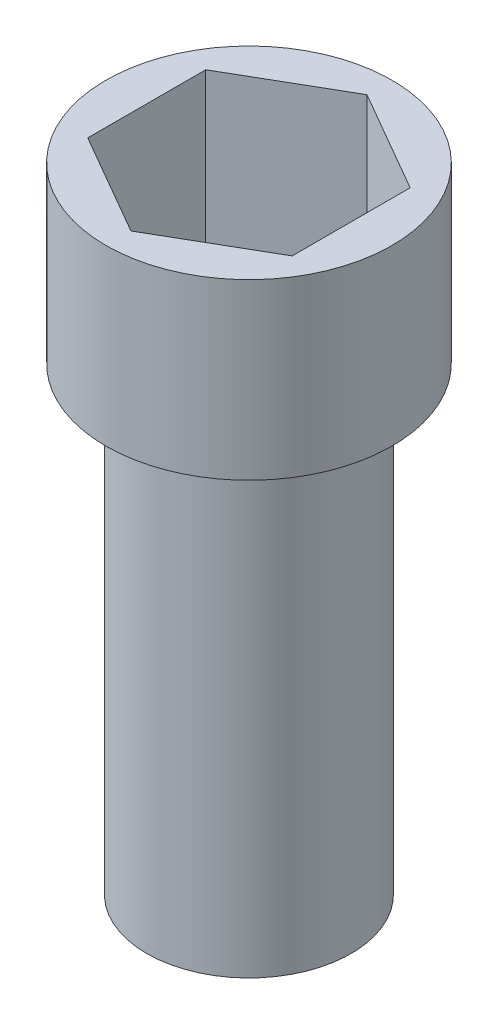
ISO-10303-21;
HEADER;
FILE_DESCRIPTION(('STEP AP214'),'2;1');
FILE_NAME('part.step','',(''),(''),'','','');
FILE_SCHEMA(('AUTOMOTIVE_DESIGN { 1 0 10303 214 1 1 1 1 }'));
ENDSEC;
DATA;
#1=APPLICATION_CONTEXT('core data for automotive mechanical design processes');
#2=APPLICATION_PROTOCOL_DEFINITION('international standard','automotive_design',2000,#1);
#3=PRODUCT_CONTEXT('',#1,'mechanical');
#4=PRODUCT('Part','Part','',(#3));
#5=PRODUCT_RELATED_PRODUCT_CATEGORY('part','',(#4));
#6=PRODUCT_DEFINITION_FORMATION('','',#4);
#7=PRODUCT_DEFINITION_CONTEXT('part definition',#1,'design');
#8=PRODUCT_DEFINITION('design','',#6,#7);
#9=PRODUCT_DEFINITION_SHAPE('','',#8);
#10=(LENGTH_UNIT() NAMED_UNIT(*) SI_UNIT(.MILLI.,.METRE.));
#11=(NAMED_UNIT(*) PLANE_ANGLE_UNIT() SI_UNIT($,.RADIAN.));
#12=(NAMED_UNIT(*) SI_UNIT($,.STERADIAN.) SOLID_ANGLE_UNIT());
#13=UNCERTAINTY_MEASURE_WITH_UNIT(LENGTH_MEASURE(1.E-05),#10,'distance_accuracy_value','');
#14=(GEOMETRIC_REPRESENTATION_CONTEXT(3) GLOBAL_UNCERTAINTY_ASSIGNED_CONTEXT((#13)) GLOBAL_UNIT_ASSIGNED_CONTEXT((#10,
#11,#12)) REPRESENTATION_CONTEXT('',''));
#15=CARTESIAN_POINT('',(0.,0.,0.));
#16=DIRECTION('',(0.,0.,1.));
#17=DIRECTION('',(1.,0.,0.));
#18=AXIS2_PLACEMENT_3D('',#15,#16,#17);
#19=CARTESIAN_POINT('',(0.,45.,0.));
#20=DIRECTION('',(0.,-1.,0.));
#21=DIRECTION('',(0.,0.,-1.));
#22=AXIS2_PLACEMENT_3D('',#19,#20,#21);
#23=CYLINDRICAL_SURFACE('',#22,10.);
#24=CARTESIAN_POINT('',(0.,45.,0.));
#25=DIRECTION('',(0.,1.,0.));
#26=DIRECTION('',(0.,0.,1.));
#27=AXIS2_PLACEMENT_3D('',#24,#25,#26);
#28=CIRCLE('',#27,10.);
#29=CARTESIAN_POINT('',(0.,45.,-10.));
#30=VERTEX_POINT('',#29);
#31=EDGE_CURVE('E11',#30,#30,#28,.T.);
#32=CARTESIAN_POINT('',(0.,0.,0.));
#33=DIRECTION('',(0.,1.,0.));
#34=DIRECTION('',(0.,0.,1.));
#35=AXIS2_PLACEMENT_3D('',#32,#33,#34);
#36=CIRCLE('',#35,10.);
#37=CARTESIAN_POINT('',(0.,0.,-10.));
#38=VERTEX_POINT('',#37);
#39=EDGE_CURVE('E47',#38,#38,#36,.T.);
#40=CARTESIAN_POINT('',(0.,45.,-10.));
#41=CARTESIAN_POINT('',(0.,44.53125,-10.));
#42=CARTESIAN_POINT('',(0.,44.0625,-10.));
#43=CARTESIAN_POINT('',(0.,43.125,-10.));
#44=CARTESIAN_POINT('',(0.,42.65625,-10.));
#45=CARTESIAN_POINT('',(0.,41.71875,-10.));
#46=CARTESIAN_POINT('',(0.,41.25,-10.));
#47=CARTESIAN_POINT('',(0.,40.3125,-10.));
#48=CARTESIAN_POINT('',(0.,39.84375,-10.));
#49=CARTESIAN_POINT('',(0.,38.90625,-10.));
#50=CARTESIAN_POINT('',(0.,38.4375,-10.));
#51=CARTESIAN_POINT('',(0.,37.5,-10.));
#52=CARTESIAN_POINT('',(0.,37.03125,-10.));
#53=CARTESIAN_POINT('',(0.,36.09375,-10.));
#54=CARTESIAN_POINT('',(0.,35.625,-10.));
#55=CARTESIAN_POINT('',(0.,34.6875,-10.));
#56=CARTESIAN_POINT('',(0.,34.21875,-10.));
#57=CARTESIAN_POINT('',(0.,33.28125,-10.));
#58=CARTESIAN_POINT('',(0.,32.8125,-10.));
#59=CARTESIAN_POINT('',(0.,31.875,-10.));
#60=CARTESIAN_POINT('',(0.,31.40625,-10.));
#61=CARTESIAN_POINT('',(0.,30.46875,-10.));
#62=CARTESIAN_POINT('',(0.,30.,-10.));
#63=CARTESIAN_POINT('',(0.,29.0625,-10.));
#64=CARTESIAN_POINT('',(0.,28.59375,-10.));
#65=CARTESIAN_POINT('',(0.,27.65625,-10.));
#66=CARTESIAN_POINT('',(0.,27.1875,-10.));
#67=CARTESIAN_POINT('',(0.,26.25,-10.));
#68=CARTESIAN_POINT('',(0.,25.78125,-10.));
#69=CARTESIAN_POINT('',(0.,24.84375,-10.));
#70=CARTESIAN_POINT('',(0.,24.375,-10.));
#71=CARTESIAN_POINT('',(0.,23.4375,-10.));
#72=CARTESIAN_POINT('',(0.,22.96875,-10.));
#73=CARTESIAN_POINT('',(0.,22.03125,-10.));
#74=CARTESIAN_POINT('',(0.,21.5625,-10.));
#75=CARTESIAN_POINT('',(0.,20.625,-10.));
#76=CARTESIAN_POINT('',(0.,20.15625,-10.));
#77=CARTESIAN_POINT('',(0.,19.21875,-10.));
#78=CARTESIAN_POINT('',(0.,18.75,-10.));
#79=CARTESIAN_POINT('',(0.,17.8125,-10.));
#80=CARTESIAN_POINT('',(0.,17.34375,-10.));
#81=CARTESIAN_POINT('',(0.,16.40625,-10.));
#82=CARTESIAN_POINT('',(0.,15.9375,-10.));
#83=CARTESIAN_POINT('',(0.,15.,-10.));
#84=CARTESIAN_POINT('',(0.,14.53125,-10.));
#85=CARTESIAN_POINT('',(0.,13.59375,-10.));
#86=CARTESIAN_POINT('',(0.,13.125,-10.));
#87=CARTESIAN_POINT('',(0.,12.1875,-10.));
#88=CARTESIAN_POINT('',(0.,11.71875,-10.));
#89=CARTESIAN_POINT('',(0.,10.78125,-10.));
#90=CARTESIAN_POINT('',(0.,10.3125,-10.));
#91=CARTESIAN_POINT('',(0.,9.375,-10.));
#92=CARTESIAN_POINT('',(0.,8.90625,-10.));
#93=CARTESIAN_POINT('',(0.,7.96874999999999,-10.));
#94=CARTESIAN_POINT('',(0.,7.5,-10.));
#95=CARTESIAN_POINT('',(0.,6.5625,-10.));
#96=CARTESIAN_POINT('',(0.,6.09375,-10.));
#97=CARTESIAN_POINT('',(0.,5.15625,-10.));
#98=CARTESIAN_POINT('',(0.,4.68749999999999,-10.));
#99=CARTESIAN_POINT('',(0.,3.74999999999999,-10.));
#100=CARTESIAN_POINT('',(0.,3.28124999999999,-10.));
#101=CARTESIAN_POINT('',(0.,2.34374999999999,-10.));
#102=CARTESIAN_POINT('',(0.,1.87499999999999,-10.));
#103=CARTESIAN_POINT('',(0.,0.937499999999992,-10.));
#104=CARTESIAN_POINT('',(0.,0.468749999999993,-10.));
#105=CARTESIAN_POINT('',(0.,0.,-10.));
#106=B_SPLINE_CURVE_WITH_KNOTS('',3,(#40,#41,#42,#43,#44,#45,#46,#47,#48,#49,#50,#51,#52,#53,
#54,#55,#56,#57,#58,#59,#60,#61,#62,#63,#64,#65,#66,#67,#68,#69,#70,#71,#72,#73,#74,#75,#76,#77,
#78,#79,#80,#81,#82,#83,#84,#85,#86,#87,#88,#89,#90,#91,#92,#93,#94,#95,#96,#97,#98,#99,#100,
#101,#102,#103,#104,#105),.UNSPECIFIED.,.F.,.F.,(4,2,2,2,2,2,2,2,2,2,2,2,2,2,2,2,2,2,2,2,2,2,2,
2,2,2,2,2,2,2,2,2,4),(0.,1.40625,2.8125,4.21875000000001,5.62500000000001,7.03125,8.4375,
9.84375000000001,11.25,12.65625,14.0625,15.46875,16.875,18.28125,19.6875,21.09375,22.5,23.90625,
25.3125,26.71875,28.125,29.53125,30.9375,32.34375,33.75,35.15625,36.5625,37.96875,39.375,
40.78125,42.1875,43.59375,45.),.UNSPECIFIED.);
#107=EDGE_CURVE('BSEAM44',#30,#38,#106,.T.);
#108=ORIENTED_EDGE('',*,*,#31,.F.);
#109=ORIENTED_EDGE('',*,*,#39,.T.);
#110=ORIENTED_EDGE('',*,*,#107,.T.);
#111=ORIENTED_EDGE('',*,*,#107,.F.);
#112=EDGE_LOOP('',(#108,#110,#109,#111));
#113=FACE_BOUND('',#112,.T.);
#114=ADVANCED_FACE('F44',(#113),#23,.T.);
#115=CARTESIAN_POINT('',(0.,0.,0.));
#116=DIRECTION('',(0.,1.,0.));
#117=DIRECTION('',(0.,0.,1.));
#118=AXIS2_PLACEMENT_3D('',#115,#116,#117);
#119=PLANE('',#118);
#120=ORIENTED_EDGE('',*,*,#39,.F.);
#121=EDGE_LOOP('',(#120));
#122=FACE_BOUND('',#121,.T.);
#123=ADVANCED_FACE('F195',(#122),#119,.F.);
#124=CARTESIAN_POINT('',(0.,62.,0.));
#125=DIRECTION('',(0.,-1.,0.));
#126=DIRECTION('',(0.,0.,-1.));
#127=AXIS2_PLACEMENT_3D('',#124,#125,#126);
#128=CYLINDRICAL_SURFACE('',#127,14.);
#129=CARTESIAN_POINT('',(0.,62.,0.));
#130=DIRECTION('',(0.,1.,0.));
#131=DIRECTION('',(0.,0.,1.));
#132=AXIS2_PLACEMENT_3D('',#129,#130,#131);
#133=CIRCLE('',#132,14.);
#134=CARTESIAN_POINT('',(0.,62.,14.));
#135=VERTEX_POINT('',#134);
#136=EDGE_CURVE('E168',#135,#135,#133,.T.);
#137=ORIENTED_EDGE('',*,*,#136,.F.);
#138=EDGE_LOOP('',(#137));
#139=FACE_BOUND('',#138,.T.);
#140=CARTESIAN_POINT('',(0.,45.,0.));
#141=DIRECTION('',(0.,1.,0.));
#142=DIRECTION('',(0.,0.,1.));
#143=AXIS2_PLACEMENT_3D('',#140,#141,#142);
#144=CIRCLE('',#143,14.);
#145=CARTESIAN_POINT('',(0.,45.,14.));
#146=VERTEX_POINT('',#145);
#147=EDGE_CURVE('E158',#146,#146,#144,.T.);
#148=ORIENTED_EDGE('',*,*,#147,.T.);
#149=EDGE_LOOP('',(#148));
#150=FACE_BOUND('',#149,.T.);
#151=ADVANCED_FACE('F176',(#139,#150),#128,.T.);
#152=CARTESIAN_POINT('',(0.,62.,0.));
#153=DIRECTION('',(0.,1.,0.));
#154=DIRECTION('',(0.,0.,1.));
#155=AXIS2_PLACEMENT_3D('',#152,#153,#154);
#156=PLANE('',#155);
#157=DIRECTION('',(-0.866025403784439,0.,-0.5));
#158=VECTOR('',#157,1.);
#159=CARTESIAN_POINT('',(10.,62.,-5.77350269189626));
#160=LINE('',#159,#158);
#161=CARTESIAN_POINT('',(10.,62.,-5.77350269189626));
#162=VERTEX_POINT('',#161);
#163=CARTESIAN_POINT('',(0.,62.,-11.5470053837925));
#164=VERTEX_POINT('',#163);
#165=EDGE_CURVE('E59',#162,#164,#160,.T.);
#166=ORIENTED_EDGE('',*,*,#165,.F.);
#167=DIRECTION('',(0.,0.,-1.));
#168=VECTOR('',#167,1.);
#169=CARTESIAN_POINT('',(10.,62.,5.77350269189626));
#170=LINE('',#169,#168);
#171=CARTESIAN_POINT('',(10.,62.,5.77350269189626));
#172=VERTEX_POINT('',#171);
#173=EDGE_CURVE('E152',#172,#162,#170,.T.);
#174=ORIENTED_EDGE('',*,*,#173,.F.);
#175=DIRECTION('',(0.866025403784439,0.,-0.5));
#176=VECTOR('',#175,1.);
#177=CARTESIAN_POINT('',(0.,62.,11.5470053837925));
#178=LINE('',#177,#176);
#179=CARTESIAN_POINT('',(0.,62.,11.5470053837925));
#180=VERTEX_POINT('',#179);
#181=EDGE_CURVE('E149',#180,#172,#178,.T.);
#182=ORIENTED_EDGE('',*,*,#181,.F.);
#183=DIRECTION('',(0.866025403784439,0.,0.5));
#184=VECTOR('',#183,1.);
#185=CARTESIAN_POINT('',(-10.,62.,5.77350269189626));
#186=LINE('',#185,#184);
#187=CARTESIAN_POINT('',(-10.,62.,5.77350269189626));
#188=VERTEX_POINT('',#187);
#189=EDGE_CURVE('E107',#188,#180,#186,.T.);
#190=ORIENTED_EDGE('',*,*,#189,.F.);
#191=DIRECTION('',(0.,0.,1.));
#192=VECTOR('',#191,1.);
#193=CARTESIAN_POINT('',(-10.,62.,-5.77350269189626));
#194=LINE('',#193,#192);
#195=CARTESIAN_POINT('',(-10.,62.,-5.77350269189626));
#196=VERTEX_POINT('',#195);
#197=EDGE_CURVE('E143',#196,#188,#194,.T.);
#198=ORIENTED_EDGE('',*,*,#197,.F.);
#199=DIRECTION('',(-0.866025403784439,0.,0.5));
#200=VECTOR('',#199,1.);
#201=CARTESIAN_POINT('',(0.,62.,-11.5470053837925));
#202=LINE('',#201,#200);
#203=EDGE_CURVE('E139',#164,#196,#202,.T.);
#204=ORIENTED_EDGE('',*,*,#203,.F.);
#205=EDGE_LOOP('',(#166,#174,#182,#190,#198,#204));
#206=FACE_BOUND('',#205,.T.);
#207=ORIENTED_EDGE('',*,*,#136,.T.);
#208=EDGE_LOOP('',(#207));
#209=FACE_BOUND('',#208,.T.);
#210=ADVANCED_FACE('F181',(#206,#209),#156,.T.);
#211=CARTESIAN_POINT('',(0.,45.,0.));
#212=DIRECTION('',(0.,1.,0.));
#213=DIRECTION('',(0.,0.,1.));
#214=AXIS2_PLACEMENT_3D('',#211,#212,#213);
#215=PLANE('',#214);
#216=ORIENTED_EDGE('',*,*,#31,.T.);
#217=EDGE_LOOP('',(#216));
#218=FACE_BOUND('',#217,.T.);
#219=ORIENTED_EDGE('',*,*,#147,.F.);
#220=EDGE_LOOP('',(#219));
#221=FACE_BOUND('',#220,.T.);
#222=ADVANCED_FACE('F178',(#218,#221),#215,.F.);
#223=CARTESIAN_POINT('',(10.,45.5,-5.77350269189626));
#224=DIRECTION('',(0.5,0.,-0.866025403784439));
#225=DIRECTION('',(-0.866025403784439,0.,-0.5));
#226=AXIS2_PLACEMENT_3D('',#223,#224,#225);
#227=PLANE('',#226);
#228=ORIENTED_EDGE('',*,*,#165,.T.);
#229=DIRECTION('',(0.,1.,0.));
#230=VECTOR('',#229,1.);
#231=CARTESIAN_POINT('',(0.,45.5,-11.5470053837925));
#232=LINE('',#231,#230);
#233=CARTESIAN_POINT('',(0.,45.5,-11.5470053837925));
#234=VERTEX_POINT('',#233);
#235=EDGE_CURVE('E89',#234,#164,#232,.T.);
#236=ORIENTED_EDGE('',*,*,#235,.F.);
#237=DIRECTION('',(-0.866025403784439,0.,-0.5));
#238=VECTOR('',#237,1.);
#239=CARTESIAN_POINT('',(10.,45.5,-5.77350269189626));
#240=LINE('',#239,#238);
#241=CARTESIAN_POINT('',(10.,45.5,-5.77350269189626));
#242=VERTEX_POINT('',#241);
#243=EDGE_CURVE('E155',#242,#234,#240,.T.);
#244=ORIENTED_EDGE('',*,*,#243,.F.);
#245=DIRECTION('',(0.,1.,0.));
#246=VECTOR('',#245,1.);
#247=CARTESIAN_POINT('',(10.,45.5,-5.77350269189626));
#248=LINE('',#247,#246);
#249=EDGE_CURVE('E67',#242,#162,#248,.T.);
#250=ORIENTED_EDGE('',*,*,#249,.T.);
#251=EDGE_LOOP('',(#228,#236,#244,#250));
#252=FACE_BOUND('',#251,.T.);
#253=ADVANCED_FACE('F180',(#252),#227,.F.);
#254=CARTESIAN_POINT('',(10.,45.5,5.77350269189626));
#255=DIRECTION('',(1.,0.,0.));
#256=DIRECTION('',(0.,0.,-1.));
#257=AXIS2_PLACEMENT_3D('',#254,#255,#256);
#258=PLANE('',#257);
#259=ORIENTED_EDGE('',*,*,#173,.T.);
#260=ORIENTED_EDGE('',*,*,#249,.F.);
#261=DIRECTION('',(0.,0.,-1.));
#262=VECTOR('',#261,1.);
#263=CARTESIAN_POINT('',(10.,45.5,5.77350269189626));
#264=LINE('',#263,#262);
#265=CARTESIAN_POINT('',(10.,45.5,5.77350269189626));
#266=VERTEX_POINT('',#265);
#267=EDGE_CURVE('E121',#266,#242,#264,.T.);
#268=ORIENTED_EDGE('',*,*,#267,.F.);
#269=DIRECTION('',(0.,1.,0.));
#270=VECTOR('',#269,1.);
#271=CARTESIAN_POINT('',(10.,45.5,5.77350269189626));
#272=LINE('',#271,#270);
#273=EDGE_CURVE('E112',#266,#172,#272,.T.);
#274=ORIENTED_EDGE('',*,*,#273,.T.);
#275=EDGE_LOOP('',(#259,#260,#268,#274));
#276=FACE_BOUND('',#275,.T.);
#277=ADVANCED_FACE('F189',(#276),#258,.F.);
#278=CARTESIAN_POINT('',(0.,45.5,11.5470053837925));
#279=DIRECTION('',(0.5,0.,0.866025403784439));
#280=DIRECTION('',(0.866025403784439,0.,-0.5));
#281=AXIS2_PLACEMENT_3D('',#278,#279,#280);
#282=PLANE('',#281);
#283=ORIENTED_EDGE('',*,*,#181,.T.);
#284=ORIENTED_EDGE('',*,*,#273,.F.);
#285=DIRECTION('',(0.866025403784439,0.,-0.5));
#286=VECTOR('',#285,1.);
#287=CARTESIAN_POINT('',(0.,45.5,11.5470053837925));
#288=LINE('',#287,#286);
#289=CARTESIAN_POINT('',(0.,45.5,11.5470053837925));
#290=VERTEX_POINT('',#289);
#291=EDGE_CURVE('E116',#290,#266,#288,.T.);
#292=ORIENTED_EDGE('',*,*,#291,.F.);
#293=DIRECTION('',(0.,1.,0.));
#294=VECTOR('',#293,1.);
#295=CARTESIAN_POINT('',(0.,45.5,11.5470053837925));
#296=LINE('',#295,#294);
#297=EDGE_CURVE('E100',#290,#180,#296,.T.);
#298=ORIENTED_EDGE('',*,*,#297,.T.);
#299=EDGE_LOOP('',(#283,#284,#292,#298));
#300=FACE_BOUND('',#299,.T.);
#301=ADVANCED_FACE('F117',(#300),#282,.F.);
#302=CARTESIAN_POINT('',(-10.,45.5,5.77350269189626));
#303=DIRECTION('',(-0.5,0.,0.866025403784439));
#304=DIRECTION('',(0.866025403784439,0.,0.5));
#305=AXIS2_PLACEMENT_3D('',#302,#303,#304);
#306=PLANE('',#305);
#307=ORIENTED_EDGE('',*,*,#189,.T.);
#308=ORIENTED_EDGE('',*,*,#297,.F.);
#309=DIRECTION('',(0.866025403784439,0.,0.5));
#310=VECTOR('',#309,1.);
#311=CARTESIAN_POINT('',(-10.,45.5,5.77350269189626));
#312=LINE('',#311,#310);
#313=CARTESIAN_POINT('',(-10.,45.5,5.77350269189626));
#314=VERTEX_POINT('',#313);
#315=EDGE_CURVE('E104',#314,#290,#312,.T.);
#316=ORIENTED_EDGE('',*,*,#315,.F.);
#317=DIRECTION('',(0.,1.,0.));
#318=VECTOR('',#317,1.);
#319=CARTESIAN_POINT('',(-10.,45.5,5.77350269189626));
#320=LINE('',#319,#318);
#321=EDGE_CURVE('E113',#314,#188,#320,.T.);
#322=ORIENTED_EDGE('',*,*,#321,.T.);
#323=EDGE_LOOP('',(#307,#308,#316,#322));
#324=FACE_BOUND('',#323,.T.);
#325=ADVANCED_FACE('F102',(#324),#306,.F.);
#326=CARTESIAN_POINT('',(-10.,45.5,-5.77350269189626));
#327=DIRECTION('',(-1.,0.,0.));
#328=DIRECTION('',(0.,0.,1.));
#329=AXIS2_PLACEMENT_3D('',#326,#327,#328);
#330=PLANE('',#329);
#331=ORIENTED_EDGE('',*,*,#197,.T.);
#332=ORIENTED_EDGE('',*,*,#321,.F.);
#333=DIRECTION('',(0.,0.,1.));
#334=VECTOR('',#333,1.);
#335=CARTESIAN_POINT('',(-10.,45.5,-5.77350269189626));
#336=LINE('',#335,#334);
#337=CARTESIAN_POINT('',(-10.,45.5,-5.77350269189626));
#338=VERTEX_POINT('',#337);
#339=EDGE_CURVE('E127',#338,#314,#336,.T.);
#340=ORIENTED_EDGE('',*,*,#339,.F.);
#341=DIRECTION('',(0.,1.,0.));
#342=VECTOR('',#341,1.);
#343=CARTESIAN_POINT('',(-10.,45.5,-5.77350269189626));
#344=LINE('',#343,#342);
#345=EDGE_CURVE('E163',#338,#196,#344,.T.);
#346=ORIENTED_EDGE('',*,*,#345,.T.);
#347=EDGE_LOOP('',(#331,#332,#340,#346));
#348=FACE_BOUND('',#347,.T.);
#349=ADVANCED_FACE('F258',(#348),#330,.F.);
#350=CARTESIAN_POINT('',(0.,45.5,-11.5470053837925));
#351=DIRECTION('',(-0.5,0.,-0.866025403784439));
#352=DIRECTION('',(-0.866025403784439,0.,0.5));
#353=AXIS2_PLACEMENT_3D('',#350,#351,#352);
#354=PLANE('',#353);
#355=ORIENTED_EDGE('',*,*,#203,.T.);
#356=ORIENTED_EDGE('',*,*,#345,.F.);
#357=DIRECTION('',(-0.866025403784439,0.,0.5));
#358=VECTOR('',#357,1.);
#359=CARTESIAN_POINT('',(0.,45.5,-11.5470053837925));
#360=LINE('',#359,#358);
#361=EDGE_CURVE('E131',#234,#338,#360,.T.);
#362=ORIENTED_EDGE('',*,*,#361,.F.);
#363=ORIENTED_EDGE('',*,*,#235,.T.);
#364=EDGE_LOOP('',(#355,#356,#362,#363));
#365=FACE_BOUND('',#364,.T.);
#366=ADVANCED_FACE('F267',(#365),#354,.F.);
#367=CARTESIAN_POINT('',(0.,45.5,0.));
#368=DIRECTION('',(0.,1.,0.));
#369=DIRECTION('',(0.,0.,1.));
#370=AXIS2_PLACEMENT_3D('',#367,#368,#369);
#371=PLANE('',#370);
#372=ORIENTED_EDGE('',*,*,#243,.T.);
#373=ORIENTED_EDGE('',*,*,#361,.T.);
#374=ORIENTED_EDGE('',*,*,#339,.T.);
#375=ORIENTED_EDGE('',*,*,#315,.T.);
#376=ORIENTED_EDGE('',*,*,#291,.T.);
#377=ORIENTED_EDGE('',*,*,#267,.T.);
#378=EDGE_LOOP('',(#372,#373,#374,#375,#376,#377));
#379=FACE_BOUND('',#378,.T.);
#380=ADVANCED_FACE('F124',(#379),#371,.T.);
#381=CLOSED_SHELL('',(#114,#123,#151,#210,#222,#253,#277,#301,#325,#349,#366,#380));
#382=MANIFOLD_SOLID_BREP('B2',#381);
#383=ADVANCED_BREP_SHAPE_REPRESENTATION('',(#18,#382),#14);
#384=SHAPE_DEFINITION_REPRESENTATION(#9,#383);
ENDSEC;
END-ISO-10303-21;
